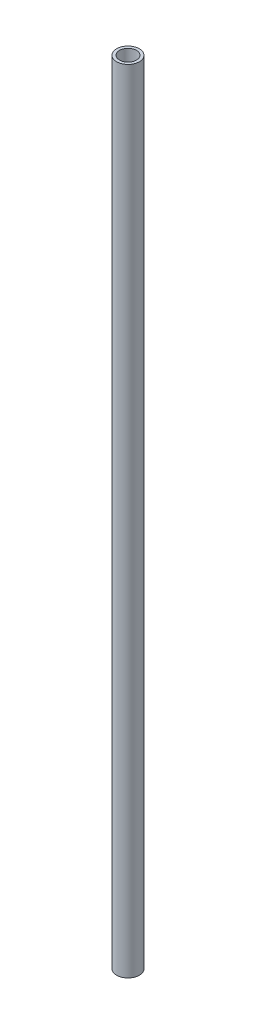
ISO-10303-21;
HEADER;
FILE_DESCRIPTION(('STEP AP214'),'2;1');
FILE_NAME('part.step','',(''),(''),'','','');
FILE_SCHEMA(('AUTOMOTIVE_DESIGN { 1 0 10303 214 1 1 1 1 }'));
ENDSEC;
DATA;
#1=APPLICATION_CONTEXT('core data for automotive mechanical design processes');
#2=APPLICATION_PROTOCOL_DEFINITION('international standard','automotive_design',2000,#1);
#3=PRODUCT_CONTEXT('',#1,'mechanical');
#4=PRODUCT('Part','Part','',(#3));
#5=PRODUCT_RELATED_PRODUCT_CATEGORY('part','',(#4));
#6=PRODUCT_DEFINITION_FORMATION('','',#4);
#7=PRODUCT_DEFINITION_CONTEXT('part definition',#1,'design');
#8=PRODUCT_DEFINITION('design','',#6,#7);
#9=PRODUCT_DEFINITION_SHAPE('','',#8);
#10=(LENGTH_UNIT() NAMED_UNIT(*) SI_UNIT(.MILLI.,.METRE.));
#11=(NAMED_UNIT(*) PLANE_ANGLE_UNIT() SI_UNIT($,.RADIAN.));
#12=(NAMED_UNIT(*) SI_UNIT($,.STERADIAN.) SOLID_ANGLE_UNIT());
#13=UNCERTAINTY_MEASURE_WITH_UNIT(LENGTH_MEASURE(1.E-05),#10,'distance_accuracy_value','');
#14=(GEOMETRIC_REPRESENTATION_CONTEXT(3) GLOBAL_UNCERTAINTY_ASSIGNED_CONTEXT((#13)) GLOBAL_UNIT_ASSIGNED_CONTEXT((#10,
#11,#12)) REPRESENTATION_CONTEXT('',''));
#15=CARTESIAN_POINT('',(0.,0.,0.));
#16=DIRECTION('',(0.,0.,1.));
#17=DIRECTION('',(1.,0.,0.));
#18=AXIS2_PLACEMENT_3D('',#15,#16,#17);
#19=CARTESIAN_POINT('',(0.,280.,0.));
#20=DIRECTION('',(0.,-1.,0.));
#21=DIRECTION('',(0.,0.,-1.));
#22=AXIS2_PLACEMENT_3D('',#19,#20,#21);
#23=CYLINDRICAL_SURFACE('',#22,3.);
#24=CARTESIAN_POINT('',(0.,280.,0.));
#25=DIRECTION('',(0.,1.,0.));
#26=DIRECTION('',(0.,0.,1.));
#27=AXIS2_PLACEMENT_3D('',#24,#25,#26);
#28=CIRCLE('',#27,3.);
#29=CARTESIAN_POINT('',(0.,280.,3.));
#30=VERTEX_POINT('',#29);
#31=EDGE_CURVE('E47',#30,#30,#28,.T.);
#32=ORIENTED_EDGE('',*,*,#31,.T.);
#33=EDGE_LOOP('',(#32));
#34=FACE_BOUND('',#33,.T.);
#35=CARTESIAN_POINT('',(0.,0.,0.));
#36=DIRECTION('',(0.,1.,0.));
#37=DIRECTION('',(0.,0.,1.));
#38=AXIS2_PLACEMENT_3D('',#35,#36,#37);
#39=CIRCLE('',#38,3.);
#40=CARTESIAN_POINT('',(0.,0.,3.));
#41=VERTEX_POINT('',#40);
#42=EDGE_CURVE('E54',#41,#41,#39,.T.);
#43=ORIENTED_EDGE('',*,*,#42,.F.);
#44=EDGE_LOOP('',(#43));
#45=FACE_BOUND('',#44,.T.);
#46=ADVANCED_FACE('F39',(#34,#45),#23,.F.);
#47=CARTESIAN_POINT('',(0.,280.,0.));
#48=DIRECTION('',(0.,-1.,0.));
#49=DIRECTION('',(0.,0.,-1.));
#50=AXIS2_PLACEMENT_3D('',#47,#48,#49);
#51=CYLINDRICAL_SURFACE('',#50,4.);
#52=CARTESIAN_POINT('',(0.,280.,0.));
#53=DIRECTION('',(0.,1.,0.));
#54=DIRECTION('',(0.,0.,1.));
#55=AXIS2_PLACEMENT_3D('',#52,#53,#54);
#56=CIRCLE('',#55,4.);
#57=CARTESIAN_POINT('',(0.,280.,4.));
#58=VERTEX_POINT('',#57);
#59=EDGE_CURVE('E10',#58,#58,#56,.T.);
#60=ORIENTED_EDGE('',*,*,#59,.F.);
#61=EDGE_LOOP('',(#60));
#62=FACE_BOUND('',#61,.T.);
#63=CARTESIAN_POINT('',(0.,0.,0.));
#64=DIRECTION('',(0.,1.,0.));
#65=DIRECTION('',(0.,0.,1.));
#66=AXIS2_PLACEMENT_3D('',#63,#64,#65);
#67=CIRCLE('',#66,4.);
#68=CARTESIAN_POINT('',(0.,0.,4.));
#69=VERTEX_POINT('',#68);
#70=EDGE_CURVE('E42',#69,#69,#67,.T.);
#71=ORIENTED_EDGE('',*,*,#70,.T.);
#72=EDGE_LOOP('',(#71));
#73=FACE_BOUND('',#72,.T.);
#74=ADVANCED_FACE('F63',(#62,#73),#51,.T.);
#75=CARTESIAN_POINT('',(0.,280.,0.));
#76=DIRECTION('',(0.,1.,0.));
#77=DIRECTION('',(0.,0.,1.));
#78=AXIS2_PLACEMENT_3D('',#75,#76,#77);
#79=PLANE('',#78);
#80=ORIENTED_EDGE('',*,*,#31,.F.);
#81=EDGE_LOOP('',(#80));
#82=FACE_BOUND('',#81,.T.);
#83=ORIENTED_EDGE('',*,*,#59,.T.);
#84=EDGE_LOOP('',(#83));
#85=FACE_BOUND('',#84,.T.);
#86=ADVANCED_FACE('F67',(#82,#85),#79,.T.);
#87=CARTESIAN_POINT('',(0.,0.,0.));
#88=DIRECTION('',(0.,1.,0.));
#89=DIRECTION('',(0.,0.,1.));
#90=AXIS2_PLACEMENT_3D('',#87,#88,#89);
#91=PLANE('',#90);
#92=ORIENTED_EDGE('',*,*,#42,.T.);
#93=EDGE_LOOP('',(#92));
#94=FACE_BOUND('',#93,.T.);
#95=ORIENTED_EDGE('',*,*,#70,.F.);
#96=EDGE_LOOP('',(#95));
#97=FACE_BOUND('',#96,.T.);
#98=ADVANCED_FACE('F65',(#94,#97),#91,.F.);
#99=CLOSED_SHELL('',(#46,#74,#86,#98));
#100=MANIFOLD_SOLID_BREP('B2',#99);
#101=ADVANCED_BREP_SHAPE_REPRESENTATION('',(#18,#100),#14);
#102=SHAPE_DEFINITION_REPRESENTATION(#9,#101);
ENDSEC;
END-ISO-10303-21;
